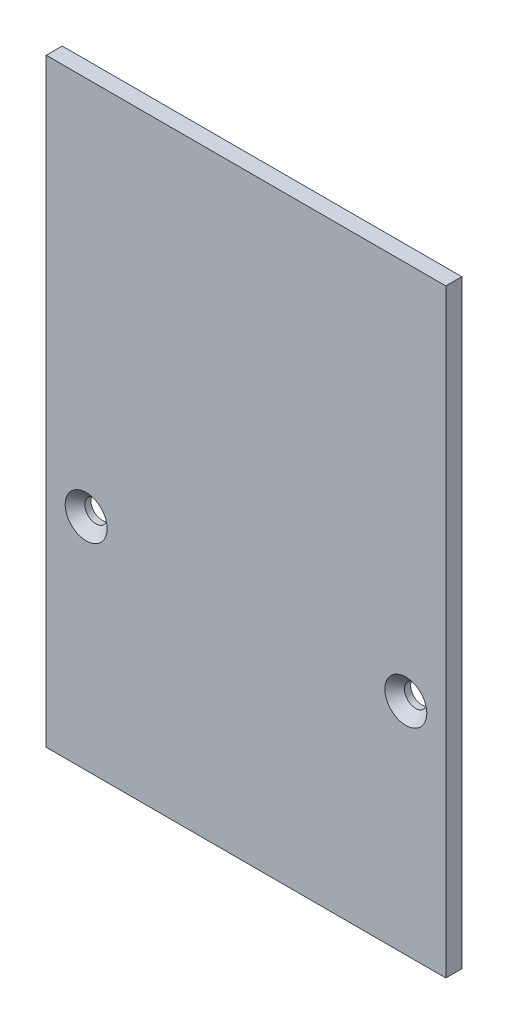
ISO-10303-21;
HEADER;
FILE_DESCRIPTION(('STEP AP214'),'2;1');
FILE_NAME('part.step','',(''),(''),'','','');
FILE_SCHEMA(('AUTOMOTIVE_DESIGN { 1 0 10303 214 1 1 1 1 }'));
ENDSEC;
DATA;
#1=APPLICATION_CONTEXT('core data for automotive mechanical design processes');
#2=APPLICATION_PROTOCOL_DEFINITION('international standard','automotive_design',2000,#1);
#3=PRODUCT_CONTEXT('',#1,'mechanical');
#4=PRODUCT('Part','Part','',(#3));
#5=PRODUCT_RELATED_PRODUCT_CATEGORY('part','',(#4));
#6=PRODUCT_DEFINITION_FORMATION('','',#4);
#7=PRODUCT_DEFINITION_CONTEXT('part definition',#1,'design');
#8=PRODUCT_DEFINITION('design','',#6,#7);
#9=PRODUCT_DEFINITION_SHAPE('','',#8);
#10=(LENGTH_UNIT() NAMED_UNIT(*) SI_UNIT(.MILLI.,.METRE.));
#11=(NAMED_UNIT(*) PLANE_ANGLE_UNIT() SI_UNIT($,.RADIAN.));
#12=(NAMED_UNIT(*) SI_UNIT($,.STERADIAN.) SOLID_ANGLE_UNIT());
#13=UNCERTAINTY_MEASURE_WITH_UNIT(LENGTH_MEASURE(1.E-05),#10,'distance_accuracy_value','');
#14=(GEOMETRIC_REPRESENTATION_CONTEXT(3) GLOBAL_UNCERTAINTY_ASSIGNED_CONTEXT((#13)) GLOBAL_UNIT_ASSIGNED_CONTEXT((#10,
#11,#12)) REPRESENTATION_CONTEXT('',''));
#15=CARTESIAN_POINT('',(0.,0.,0.));
#16=DIRECTION('',(0.,0.,1.));
#17=DIRECTION('',(1.,0.,0.));
#18=AXIS2_PLACEMENT_3D('',#15,#16,#17);
#19=CARTESIAN_POINT('',(90.,55.,-1.));
#20=DIRECTION('',(0.,0.,1.));
#21=DIRECTION('',(1.,0.,0.));
#22=AXIS2_PLACEMENT_3D('',#19,#20,#21);
#23=CYLINDRICAL_SURFACE('',#22,2.8);
#24=DIRECTION('',(0.,0.,1.));
#25=VECTOR('',#24,1.);
#26=CARTESIAN_POINT('',(92.8,55.,-1.));
#27=LINE('',#26,#25);
#28=CARTESIAN_POINT('',(92.8,55.,0.));
#29=VERTEX_POINT('',#28);
#30=CARTESIAN_POINT('',(92.8,55.,1.55));
#31=VERTEX_POINT('',#30);
#32=EDGE_CURVE('E11',#29,#31,#27,.T.);
#33=ORIENTED_EDGE('',*,*,#32,.F.);
#34=CARTESIAN_POINT('',(90.,55.,0.));
#35=DIRECTION('',(0.,0.,1.));
#36=DIRECTION('',(1.,0.,0.));
#37=AXIS2_PLACEMENT_3D('',#34,#35,#36);
#38=CIRCLE('',#37,2.8);
#39=EDGE_CURVE('E60',#29,#29,#38,.T.);
#40=ORIENTED_EDGE('',*,*,#39,.F.);
#41=ORIENTED_EDGE('',*,*,#32,.T.);
#42=CARTESIAN_POINT('',(90.,55.,1.55));
#43=DIRECTION('',(0.,0.,1.));
#44=DIRECTION('',(0.,-1.,0.));
#45=AXIS2_PLACEMENT_3D('',#42,#43,#44);
#46=CIRCLE('',#45,2.8);
#47=EDGE_CURVE('E62',#31,#31,#46,.T.);
#48=ORIENTED_EDGE('',*,*,#47,.T.);
#49=EDGE_LOOP('',(#33,#40,#41,#48));
#50=FACE_BOUND('',#49,.T.);
#51=ADVANCED_FACE('F16',(#50),#23,.F.);
#52=CARTESIAN_POINT('',(10.,55.,-1.));
#53=DIRECTION('',(0.,0.,1.));
#54=DIRECTION('',(1.,0.,0.));
#55=AXIS2_PLACEMENT_3D('',#52,#53,#54);
#56=CYLINDRICAL_SURFACE('',#55,2.8);
#57=DIRECTION('',(0.,0.,1.));
#58=VECTOR('',#57,1.);
#59=CARTESIAN_POINT('',(12.8,55.,-1.));
#60=LINE('',#59,#58);
#61=CARTESIAN_POINT('',(12.8,55.,0.));
#62=VERTEX_POINT('',#61);
#63=CARTESIAN_POINT('',(12.8,55.,1.55));
#64=VERTEX_POINT('',#63);
#65=EDGE_CURVE('E26',#62,#64,#60,.T.);
#66=ORIENTED_EDGE('',*,*,#65,.F.);
#67=CARTESIAN_POINT('',(10.,55.,0.));
#68=DIRECTION('',(0.,0.,1.));
#69=DIRECTION('',(1.,0.,0.));
#70=AXIS2_PLACEMENT_3D('',#67,#68,#69);
#71=CIRCLE('',#70,2.8);
#72=EDGE_CURVE('E68',#62,#62,#71,.T.);
#73=ORIENTED_EDGE('',*,*,#72,.F.);
#74=ORIENTED_EDGE('',*,*,#65,.T.);
#75=CARTESIAN_POINT('',(10.,55.,1.55));
#76=DIRECTION('',(0.,0.,1.));
#77=DIRECTION('',(0.,-1.,0.));
#78=AXIS2_PLACEMENT_3D('',#75,#76,#77);
#79=CIRCLE('',#78,2.8);
#80=EDGE_CURVE('E67',#64,#64,#79,.T.);
#81=ORIENTED_EDGE('',*,*,#80,.T.);
#82=EDGE_LOOP('',(#66,#73,#74,#81));
#83=FACE_BOUND('',#82,.T.);
#84=ADVANCED_FACE('F18',(#83),#56,.F.);
#85=CARTESIAN_POINT('',(90.,55.,-0.25));
#86=DIRECTION('',(0.,0.,1.));
#87=DIRECTION('',(1.,0.,0.));
#88=AXIS2_PLACEMENT_3D('',#85,#86,#87);
#89=CONICAL_SURFACE('',#88,0.999999999999103,0.785398163397);
#90=ORIENTED_EDGE('',*,*,#47,.F.);
#91=DIRECTION('',(0.707106781186548,0.,0.707106781186548));
#92=VECTOR('',#91,1.);
#93=CARTESIAN_POINT('',(90.,55.,-1.25));
#94=LINE('',#93,#92);
#95=CARTESIAN_POINT('',(95.25,55.,4.));
#96=VERTEX_POINT('',#95);
#97=EDGE_CURVE('E84',#31,#96,#94,.T.);
#98=ORIENTED_EDGE('',*,*,#97,.T.);
#99=CARTESIAN_POINT('',(90.,55.,4.));
#100=DIRECTION('',(0.,0.,1.));
#101=DIRECTION('',(1.,0.,0.));
#102=AXIS2_PLACEMENT_3D('',#99,#100,#101);
#103=CIRCLE('',#102,5.25);
#104=EDGE_CURVE('E99',#96,#96,#103,.T.);
#105=ORIENTED_EDGE('',*,*,#104,.T.);
#106=ORIENTED_EDGE('',*,*,#97,.F.);
#107=EDGE_LOOP('',(#90,#98,#105,#106));
#108=FACE_BOUND('',#107,.T.);
#109=ADVANCED_FACE('F221',(#108),#89,.F.);
#110=CARTESIAN_POINT('',(10.,55.,-0.25));
#111=DIRECTION('',(0.,0.,1.));
#112=DIRECTION('',(1.,0.,0.));
#113=AXIS2_PLACEMENT_3D('',#110,#111,#112);
#114=CONICAL_SURFACE('',#113,0.999999999999103,0.785398163397);
#115=ORIENTED_EDGE('',*,*,#80,.F.);
#116=DIRECTION('',(0.707106781186548,0.,0.707106781186548));
#117=VECTOR('',#116,1.);
#118=CARTESIAN_POINT('',(10.,55.,-1.25));
#119=LINE('',#118,#117);
#120=CARTESIAN_POINT('',(15.25,55.,4.));
#121=VERTEX_POINT('',#120);
#122=EDGE_CURVE('E74',#64,#121,#119,.T.);
#123=ORIENTED_EDGE('',*,*,#122,.T.);
#124=CARTESIAN_POINT('',(10.,55.,4.));
#125=DIRECTION('',(0.,0.,1.));
#126=DIRECTION('',(1.,0.,0.));
#127=AXIS2_PLACEMENT_3D('',#124,#125,#126);
#128=CIRCLE('',#127,5.25);
#129=EDGE_CURVE('E96',#121,#121,#128,.T.);
#130=ORIENTED_EDGE('',*,*,#129,.T.);
#131=ORIENTED_EDGE('',*,*,#122,.F.);
#132=EDGE_LOOP('',(#115,#123,#130,#131));
#133=FACE_BOUND('',#132,.T.);
#134=ADVANCED_FACE('F94',(#133),#114,.F.);
#135=CARTESIAN_POINT('',(100.,0.,0.));
#136=DIRECTION('',(1.,0.,0.));
#137=DIRECTION('',(0.,1.,0.));
#138=AXIS2_PLACEMENT_3D('',#135,#136,#137);
#139=PLANE('',#138);
#140=DIRECTION('',(0.,0.,1.));
#141=VECTOR('',#140,1.);
#142=CARTESIAN_POINT('',(100.,0.,0.));
#143=LINE('',#142,#141);
#144=CARTESIAN_POINT('',(100.,0.,0.));
#145=VERTEX_POINT('',#144);
#146=CARTESIAN_POINT('',(100.,0.,4.));
#147=VERTEX_POINT('',#146);
#148=EDGE_CURVE('E134',#145,#147,#143,.T.);
#149=ORIENTED_EDGE('',*,*,#148,.F.);
#150=DIRECTION('',(0.,1.,0.));
#151=VECTOR('',#150,1.);
#152=CARTESIAN_POINT('',(100.,0.,0.));
#153=LINE('',#152,#151);
#154=CARTESIAN_POINT('',(100.,150.,0.));
#155=VERTEX_POINT('',#154);
#156=EDGE_CURVE('E78',#145,#155,#153,.T.);
#157=ORIENTED_EDGE('',*,*,#156,.T.);
#158=DIRECTION('',(0.,0.,1.));
#159=VECTOR('',#158,1.);
#160=CARTESIAN_POINT('',(100.,150.,0.));
#161=LINE('',#160,#159);
#162=CARTESIAN_POINT('',(100.,150.,4.));
#163=VERTEX_POINT('',#162);
#164=EDGE_CURVE('E118',#155,#163,#161,.T.);
#165=ORIENTED_EDGE('',*,*,#164,.T.);
#166=DIRECTION('',(0.,1.,0.));
#167=VECTOR('',#166,1.);
#168=CARTESIAN_POINT('',(100.,0.,4.));
#169=LINE('',#168,#167);
#170=EDGE_CURVE('E110',#147,#163,#169,.T.);
#171=ORIENTED_EDGE('',*,*,#170,.F.);
#172=EDGE_LOOP('',(#149,#157,#165,#171));
#173=FACE_BOUND('',#172,.T.);
#174=ADVANCED_FACE('F161',(#173),#139,.T.);
#175=CARTESIAN_POINT('',(0.,0.,0.));
#176=DIRECTION('',(0.,0.,1.));
#177=DIRECTION('',(1.,0.,0.));
#178=AXIS2_PLACEMENT_3D('',#175,#176,#177);
#179=PLANE('',#178);
#180=ORIENTED_EDGE('',*,*,#39,.T.);
#181=EDGE_LOOP('',(#180));
#182=FACE_BOUND('',#181,.T.);
#183=ORIENTED_EDGE('',*,*,#72,.T.);
#184=EDGE_LOOP('',(#183));
#185=FACE_BOUND('',#184,.T.);
#186=DIRECTION('',(1.,0.,0.));
#187=VECTOR('',#186,1.);
#188=CARTESIAN_POINT('',(0.,150.,0.));
#189=LINE('',#188,#187);
#190=CARTESIAN_POINT('',(0.,150.,0.));
#191=VERTEX_POINT('',#190);
#192=EDGE_CURVE('E106',#191,#155,#189,.T.);
#193=ORIENTED_EDGE('',*,*,#192,.T.);
#194=ORIENTED_EDGE('',*,*,#156,.F.);
#195=DIRECTION('',(1.,0.,0.));
#196=VECTOR('',#195,1.);
#197=CARTESIAN_POINT('',(0.,0.,0.));
#198=LINE('',#197,#196);
#199=CARTESIAN_POINT('',(0.,0.,0.));
#200=VERTEX_POINT('',#199);
#201=EDGE_CURVE('E141',#200,#145,#198,.T.);
#202=ORIENTED_EDGE('',*,*,#201,.F.);
#203=DIRECTION('',(0.,1.,0.));
#204=VECTOR('',#203,1.);
#205=CARTESIAN_POINT('',(0.,0.,0.));
#206=LINE('',#205,#204);
#207=EDGE_CURVE('E185',#200,#191,#206,.T.);
#208=ORIENTED_EDGE('',*,*,#207,.T.);
#209=EDGE_LOOP('',(#193,#194,#202,#208));
#210=FACE_BOUND('',#209,.T.);
#211=ADVANCED_FACE('F64',(#182,#185,#210),#179,.F.);
#212=CARTESIAN_POINT('',(0.,150.,0.));
#213=DIRECTION('',(0.,1.,0.));
#214=DIRECTION('',(1.,0.,0.));
#215=AXIS2_PLACEMENT_3D('',#212,#213,#214);
#216=PLANE('',#215);
#217=ORIENTED_EDGE('',*,*,#192,.F.);
#218=DIRECTION('',(0.,0.,1.));
#219=VECTOR('',#218,1.);
#220=CARTESIAN_POINT('',(0.,150.,0.));
#221=LINE('',#220,#219);
#222=CARTESIAN_POINT('',(0.,150.,4.));
#223=VERTEX_POINT('',#222);
#224=EDGE_CURVE('E193',#191,#223,#221,.T.);
#225=ORIENTED_EDGE('',*,*,#224,.T.);
#226=DIRECTION('',(1.,0.,0.));
#227=VECTOR('',#226,1.);
#228=CARTESIAN_POINT('',(0.,150.,4.));
#229=LINE('',#228,#227);
#230=EDGE_CURVE('E100',#223,#163,#229,.T.);
#231=ORIENTED_EDGE('',*,*,#230,.T.);
#232=ORIENTED_EDGE('',*,*,#164,.F.);
#233=EDGE_LOOP('',(#217,#225,#231,#232));
#234=FACE_BOUND('',#233,.T.);
#235=ADVANCED_FACE('F205',(#234),#216,.T.);
#236=CARTESIAN_POINT('',(0.,0.,4.));
#237=DIRECTION('',(0.,0.,1.));
#238=DIRECTION('',(1.,0.,0.));
#239=AXIS2_PLACEMENT_3D('',#236,#237,#238);
#240=PLANE('',#239);
#241=ORIENTED_EDGE('',*,*,#104,.F.);
#242=EDGE_LOOP('',(#241));
#243=FACE_BOUND('',#242,.T.);
#244=ORIENTED_EDGE('',*,*,#129,.F.);
#245=EDGE_LOOP('',(#244));
#246=FACE_BOUND('',#245,.T.);
#247=DIRECTION('',(0.,1.,0.));
#248=VECTOR('',#247,1.);
#249=CARTESIAN_POINT('',(0.,0.,4.));
#250=LINE('',#249,#248);
#251=CARTESIAN_POINT('',(0.,0.,4.));
#252=VERTEX_POINT('',#251);
#253=EDGE_CURVE('E199',#252,#223,#250,.T.);
#254=ORIENTED_EDGE('',*,*,#253,.F.);
#255=DIRECTION('',(1.,0.,0.));
#256=VECTOR('',#255,1.);
#257=CARTESIAN_POINT('',(0.,0.,4.));
#258=LINE('',#257,#256);
#259=EDGE_CURVE('E137',#252,#147,#258,.T.);
#260=ORIENTED_EDGE('',*,*,#259,.T.);
#261=ORIENTED_EDGE('',*,*,#170,.T.);
#262=ORIENTED_EDGE('',*,*,#230,.F.);
#263=EDGE_LOOP('',(#254,#260,#261,#262));
#264=FACE_BOUND('',#263,.T.);
#265=ADVANCED_FACE('F154',(#243,#246,#264),#240,.T.);
#266=CARTESIAN_POINT('',(0.,0.,0.));
#267=DIRECTION('',(0.,1.,0.));
#268=DIRECTION('',(1.,0.,0.));
#269=AXIS2_PLACEMENT_3D('',#266,#267,#268);
#270=PLANE('',#269);
#271=ORIENTED_EDGE('',*,*,#148,.T.);
#272=ORIENTED_EDGE('',*,*,#259,.F.);
#273=DIRECTION('',(0.,0.,1.));
#274=VECTOR('',#273,1.);
#275=CARTESIAN_POINT('',(0.,0.,0.));
#276=LINE('',#275,#274);
#277=EDGE_CURVE('E138',#200,#252,#276,.T.);
#278=ORIENTED_EDGE('',*,*,#277,.F.);
#279=ORIENTED_EDGE('',*,*,#201,.T.);
#280=EDGE_LOOP('',(#271,#272,#278,#279));
#281=FACE_BOUND('',#280,.T.);
#282=ADVANCED_FACE('F188',(#281),#270,.F.);
#283=CARTESIAN_POINT('',(0.,0.,0.));
#284=DIRECTION('',(1.,0.,0.));
#285=DIRECTION('',(0.,1.,0.));
#286=AXIS2_PLACEMENT_3D('',#283,#284,#285);
#287=PLANE('',#286);
#288=ORIENTED_EDGE('',*,*,#253,.T.);
#289=ORIENTED_EDGE('',*,*,#224,.F.);
#290=ORIENTED_EDGE('',*,*,#207,.F.);
#291=ORIENTED_EDGE('',*,*,#277,.T.);
#292=EDGE_LOOP('',(#288,#289,#290,#291));
#293=FACE_BOUND('',#292,.T.);
#294=ADVANCED_FACE('F192',(#293),#287,.F.);
#295=CLOSED_SHELL('',(#51,#84,#109,#134,#174,#211,#235,#265,#282,#294));
#296=MANIFOLD_SOLID_BREP('B1',#295);
#297=ADVANCED_BREP_SHAPE_REPRESENTATION('',(#18,#296),#14);
#298=SHAPE_DEFINITION_REPRESENTATION(#9,#297);
ENDSEC;
END-ISO-10303-21;
